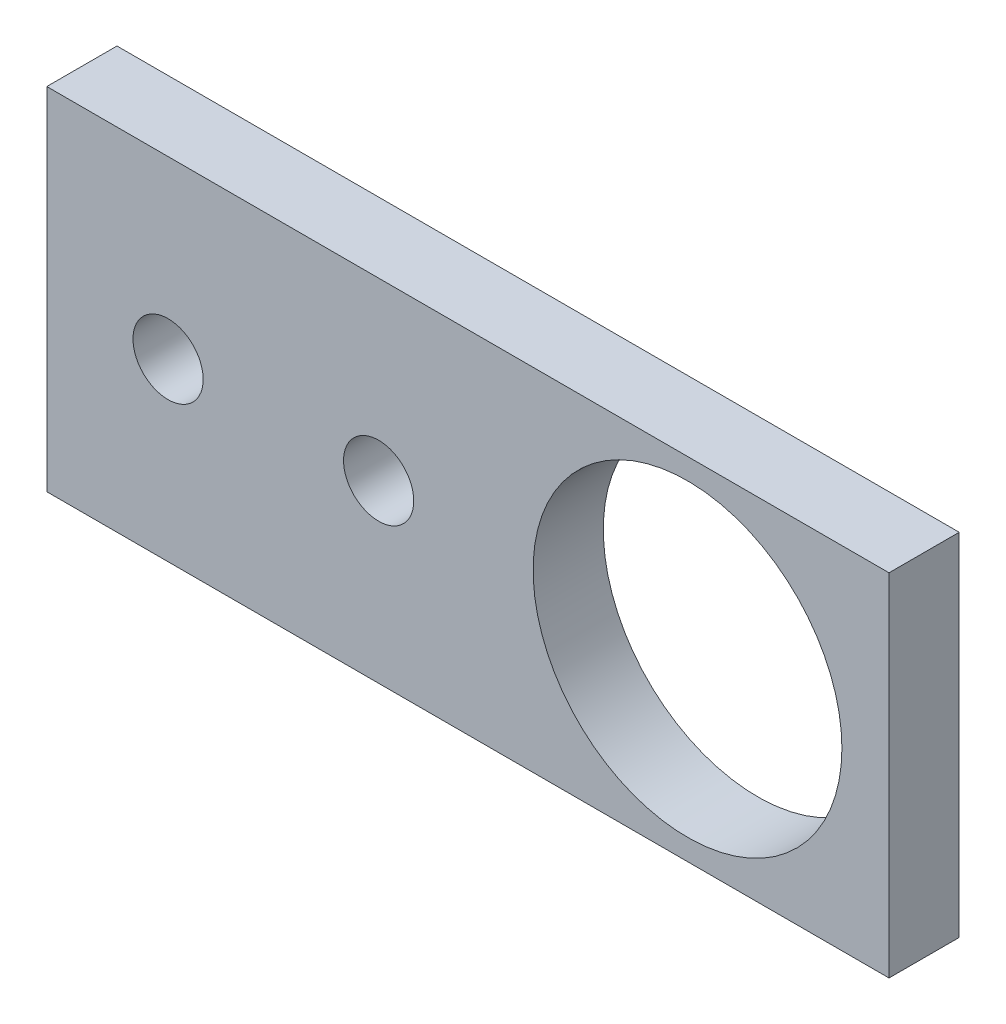
ISO-10303-21;
HEADER;
FILE_DESCRIPTION(('STEP AP214'),'2;1');
FILE_NAME('part.step','',(''),(''),'','','');
FILE_SCHEMA(('AUTOMOTIVE_DESIGN { 1 0 10303 214 1 1 1 1 }'));
ENDSEC;
DATA;
#1=APPLICATION_CONTEXT('core data for automotive mechanical design processes');
#2=APPLICATION_PROTOCOL_DEFINITION('international standard','automotive_design',2000,#1);
#3=PRODUCT_CONTEXT('',#1,'mechanical');
#4=PRODUCT('Part','Part','',(#3));
#5=PRODUCT_RELATED_PRODUCT_CATEGORY('part','',(#4));
#6=PRODUCT_DEFINITION_FORMATION('','',#4);
#7=PRODUCT_DEFINITION_CONTEXT('part definition',#1,'design');
#8=PRODUCT_DEFINITION('design','',#6,#7);
#9=PRODUCT_DEFINITION_SHAPE('','',#8);
#10=(LENGTH_UNIT() NAMED_UNIT(*) SI_UNIT(.MILLI.,.METRE.));
#11=(NAMED_UNIT(*) PLANE_ANGLE_UNIT() SI_UNIT($,.RADIAN.));
#12=(NAMED_UNIT(*) SI_UNIT($,.STERADIAN.) SOLID_ANGLE_UNIT());
#13=UNCERTAINTY_MEASURE_WITH_UNIT(LENGTH_MEASURE(1.E-05),#10,'distance_accuracy_value','');
#14=(GEOMETRIC_REPRESENTATION_CONTEXT(3) GLOBAL_UNCERTAINTY_ASSIGNED_CONTEXT((#13)) GLOBAL_UNIT_ASSIGNED_CONTEXT((#10,
#11,#12)) REPRESENTATION_CONTEXT('',''));
#15=CARTESIAN_POINT('',(0.,0.,0.));
#16=DIRECTION('',(0.,0.,1.));
#17=DIRECTION('',(1.,0.,0.));
#18=AXIS2_PLACEMENT_3D('',#15,#16,#17);
#19=CARTESIAN_POINT('',(0.,0.,5.));
#20=DIRECTION('',(0.,0.,-1.));
#21=DIRECTION('',(-1.,0.,0.));
#22=AXIS2_PLACEMENT_3D('',#19,#20,#21);
#23=PLANE('',#22);
#24=DIRECTION('',(0.,-1.,0.));
#25=VECTOR('',#24,1.);
#26=CARTESIAN_POINT('',(-30.,12.5,5.));
#27=LINE('',#26,#25);
#28=CARTESIAN_POINT('',(-30.,12.5,5.));
#29=VERTEX_POINT('',#28);
#30=CARTESIAN_POINT('',(-30.,-12.5,5.));
#31=VERTEX_POINT('',#30);
#32=EDGE_CURVE('E92',#29,#31,#27,.T.);
#33=ORIENTED_EDGE('',*,*,#32,.T.);
#34=DIRECTION('',(1.,0.,0.));
#35=VECTOR('',#34,1.);
#36=CARTESIAN_POINT('',(30.,-12.5,5.));
#37=LINE('',#36,#35);
#38=CARTESIAN_POINT('',(30.,-12.5,5.));
#39=VERTEX_POINT('',#38);
#40=EDGE_CURVE('E87',#31,#39,#37,.T.);
#41=ORIENTED_EDGE('',*,*,#40,.T.);
#42=DIRECTION('',(0.,1.,0.));
#43=VECTOR('',#42,1.);
#44=CARTESIAN_POINT('',(30.,12.5,5.));
#45=LINE('',#44,#43);
#46=CARTESIAN_POINT('',(30.,12.5,5.));
#47=VERTEX_POINT('',#46);
#48=EDGE_CURVE('E90',#39,#47,#45,.T.);
#49=ORIENTED_EDGE('',*,*,#48,.T.);
#50=DIRECTION('',(-1.,0.,0.));
#51=VECTOR('',#50,1.);
#52=CARTESIAN_POINT('',(30.,12.5,5.));
#53=LINE('',#52,#51);
#54=EDGE_CURVE('E57',#47,#29,#53,.T.);
#55=ORIENTED_EDGE('',*,*,#54,.T.);
#56=EDGE_LOOP('',(#33,#41,#49,#55));
#57=FACE_BOUND('',#56,.T.);
#58=CARTESIAN_POINT('',(-21.359853693078,0.,5.));
#59=DIRECTION('',(0.,0.,1.));
#60=DIRECTION('',(1.,0.,0.));
#61=AXIS2_PLACEMENT_3D('',#58,#59,#60);
#62=CIRCLE('',#61,2.5);
#63=CARTESIAN_POINT('',(-18.859853693078,0.,5.));
#64=VERTEX_POINT('',#63);
#65=EDGE_CURVE('E112',#64,#64,#62,.T.);
#66=ORIENTED_EDGE('',*,*,#65,.F.);
#67=EDGE_LOOP('',(#66));
#68=FACE_BOUND('',#67,.T.);
#69=CARTESIAN_POINT('',(15.644174595942,0.,5.));
#70=DIRECTION('',(0.,0.,1.));
#71=DIRECTION('',(1.,0.,0.));
#72=AXIS2_PLACEMENT_3D('',#69,#70,#71);
#73=CIRCLE('',#72,11.);
#74=CARTESIAN_POINT('',(26.644174595942,0.,5.));
#75=VERTEX_POINT('',#74);
#76=EDGE_CURVE('E134',#75,#75,#73,.T.);
#77=ORIENTED_EDGE('',*,*,#76,.F.);
#78=EDGE_LOOP('',(#77));
#79=FACE_BOUND('',#78,.T.);
#80=CARTESIAN_POINT('',(-6.35985369307797,0.,5.));
#81=DIRECTION('',(0.,0.,1.));
#82=DIRECTION('',(1.,0.,0.));
#83=AXIS2_PLACEMENT_3D('',#80,#81,#82);
#84=CIRCLE('',#83,2.5);
#85=CARTESIAN_POINT('',(-3.85985369307797,0.,5.));
#86=VERTEX_POINT('',#85);
#87=EDGE_CURVE('E142',#86,#86,#84,.T.);
#88=ORIENTED_EDGE('',*,*,#87,.F.);
#89=EDGE_LOOP('',(#88));
#90=FACE_BOUND('',#89,.T.);
#91=ADVANCED_FACE('F39',(#57,#68,#79,#90),#23,.F.);
#92=CARTESIAN_POINT('',(0.,0.,0.));
#93=DIRECTION('',(0.,0.,-1.));
#94=DIRECTION('',(-1.,0.,0.));
#95=AXIS2_PLACEMENT_3D('',#92,#93,#94);
#96=PLANE('',#95);
#97=CARTESIAN_POINT('',(15.644174595942,0.,0.));
#98=DIRECTION('',(0.,0.,1.));
#99=DIRECTION('',(1.,0.,0.));
#100=AXIS2_PLACEMENT_3D('',#97,#98,#99);
#101=CIRCLE('',#100,11.);
#102=CARTESIAN_POINT('',(26.644174595942,0.,0.));
#103=VERTEX_POINT('',#102);
#104=EDGE_CURVE('E138',#103,#103,#101,.T.);
#105=ORIENTED_EDGE('',*,*,#104,.T.);
#106=EDGE_LOOP('',(#105));
#107=FACE_BOUND('',#106,.T.);
#108=DIRECTION('',(0.,-1.,0.));
#109=VECTOR('',#108,1.);
#110=CARTESIAN_POINT('',(-30.,12.5,0.));
#111=LINE('',#110,#109);
#112=CARTESIAN_POINT('',(-30.,12.5,0.));
#113=VERTEX_POINT('',#112);
#114=CARTESIAN_POINT('',(-30.,-12.5,0.));
#115=VERTEX_POINT('',#114);
#116=EDGE_CURVE('E108',#113,#115,#111,.T.);
#117=ORIENTED_EDGE('',*,*,#116,.F.);
#118=DIRECTION('',(-1.,0.,0.));
#119=VECTOR('',#118,1.);
#120=CARTESIAN_POINT('',(30.,12.5,0.));
#121=LINE('',#120,#119);
#122=CARTESIAN_POINT('',(30.,12.5,0.));
#123=VERTEX_POINT('',#122);
#124=EDGE_CURVE('E80',#123,#113,#121,.T.);
#125=ORIENTED_EDGE('',*,*,#124,.F.);
#126=DIRECTION('',(0.,1.,0.));
#127=VECTOR('',#126,1.);
#128=CARTESIAN_POINT('',(30.,12.5,0.));
#129=LINE('',#128,#127);
#130=CARTESIAN_POINT('',(30.,-12.5,0.));
#131=VERTEX_POINT('',#130);
#132=EDGE_CURVE('E74',#131,#123,#129,.T.);
#133=ORIENTED_EDGE('',*,*,#132,.F.);
#134=DIRECTION('',(1.,0.,0.));
#135=VECTOR('',#134,1.);
#136=CARTESIAN_POINT('',(30.,-12.5,0.));
#137=LINE('',#136,#135);
#138=EDGE_CURVE('E97',#115,#131,#137,.T.);
#139=ORIENTED_EDGE('',*,*,#138,.F.);
#140=EDGE_LOOP('',(#117,#125,#133,#139));
#141=FACE_BOUND('',#140,.T.);
#142=CARTESIAN_POINT('',(-21.359853693078,0.,0.));
#143=DIRECTION('',(0.,0.,1.));
#144=DIRECTION('',(1.,0.,0.));
#145=AXIS2_PLACEMENT_3D('',#142,#143,#144);
#146=CIRCLE('',#145,2.5);
#147=CARTESIAN_POINT('',(-18.859853693078,0.,0.));
#148=VERTEX_POINT('',#147);
#149=EDGE_CURVE('E130',#148,#148,#146,.T.);
#150=ORIENTED_EDGE('',*,*,#149,.T.);
#151=EDGE_LOOP('',(#150));
#152=FACE_BOUND('',#151,.T.);
#153=CARTESIAN_POINT('',(-6.35985369307797,0.,0.));
#154=DIRECTION('',(0.,0.,1.));
#155=DIRECTION('',(1.,0.,0.));
#156=AXIS2_PLACEMENT_3D('',#153,#154,#155);
#157=CIRCLE('',#156,2.5);
#158=CARTESIAN_POINT('',(-3.85985369307797,0.,0.));
#159=VERTEX_POINT('',#158);
#160=EDGE_CURVE('E146',#159,#159,#157,.T.);
#161=ORIENTED_EDGE('',*,*,#160,.T.);
#162=EDGE_LOOP('',(#161));
#163=FACE_BOUND('',#162,.T.);
#164=ADVANCED_FACE('F125',(#107,#141,#152,#163),#96,.T.);
#165=CARTESIAN_POINT('',(-30.,12.5,5.));
#166=DIRECTION('',(1.,0.,0.));
#167=DIRECTION('',(0.,1.,0.));
#168=AXIS2_PLACEMENT_3D('',#165,#166,#167);
#169=PLANE('',#168);
#170=ORIENTED_EDGE('',*,*,#116,.T.);
#171=DIRECTION('',(0.,0.,-1.));
#172=VECTOR('',#171,1.);
#173=CARTESIAN_POINT('',(-30.,-12.5,5.));
#174=LINE('',#173,#172);
#175=EDGE_CURVE('E11',#31,#115,#174,.T.);
#176=ORIENTED_EDGE('',*,*,#175,.F.);
#177=ORIENTED_EDGE('',*,*,#32,.F.);
#178=DIRECTION('',(0.,0.,-1.));
#179=VECTOR('',#178,1.);
#180=CARTESIAN_POINT('',(-30.,12.5,5.));
#181=LINE('',#180,#179);
#182=EDGE_CURVE('E104',#29,#113,#181,.T.);
#183=ORIENTED_EDGE('',*,*,#182,.T.);
#184=EDGE_LOOP('',(#170,#176,#177,#183));
#185=FACE_BOUND('',#184,.T.);
#186=ADVANCED_FACE('F41',(#185),#169,.F.);
#187=CARTESIAN_POINT('',(30.,-12.5,5.));
#188=DIRECTION('',(0.,1.,0.));
#189=DIRECTION('',(-1.,0.,0.));
#190=AXIS2_PLACEMENT_3D('',#187,#188,#189);
#191=PLANE('',#190);
#192=ORIENTED_EDGE('',*,*,#138,.T.);
#193=DIRECTION('',(0.,0.,-1.));
#194=VECTOR('',#193,1.);
#195=CARTESIAN_POINT('',(30.,-12.5,5.));
#196=LINE('',#195,#194);
#197=EDGE_CURVE('E49',#39,#131,#196,.T.);
#198=ORIENTED_EDGE('',*,*,#197,.F.);
#199=ORIENTED_EDGE('',*,*,#40,.F.);
#200=ORIENTED_EDGE('',*,*,#175,.T.);
#201=EDGE_LOOP('',(#192,#198,#199,#200));
#202=FACE_BOUND('',#201,.T.);
#203=ADVANCED_FACE('F96',(#202),#191,.F.);
#204=CARTESIAN_POINT('',(30.,12.5,5.));
#205=DIRECTION('',(-1.,0.,0.));
#206=DIRECTION('',(0.,-1.,0.));
#207=AXIS2_PLACEMENT_3D('',#204,#205,#206);
#208=PLANE('',#207);
#209=ORIENTED_EDGE('',*,*,#132,.T.);
#210=DIRECTION('',(0.,0.,-1.));
#211=VECTOR('',#210,1.);
#212=CARTESIAN_POINT('',(30.,12.5,5.));
#213=LINE('',#212,#211);
#214=EDGE_CURVE('E99',#47,#123,#213,.T.);
#215=ORIENTED_EDGE('',*,*,#214,.F.);
#216=ORIENTED_EDGE('',*,*,#48,.F.);
#217=ORIENTED_EDGE('',*,*,#197,.T.);
#218=EDGE_LOOP('',(#209,#215,#216,#217));
#219=FACE_BOUND('',#218,.T.);
#220=ADVANCED_FACE('F100',(#219),#208,.F.);
#221=CARTESIAN_POINT('',(30.,12.5,5.));
#222=DIRECTION('',(0.,-1.,0.));
#223=DIRECTION('',(1.,0.,0.));
#224=AXIS2_PLACEMENT_3D('',#221,#222,#223);
#225=PLANE('',#224);
#226=ORIENTED_EDGE('',*,*,#124,.T.);
#227=ORIENTED_EDGE('',*,*,#182,.F.);
#228=ORIENTED_EDGE('',*,*,#54,.F.);
#229=ORIENTED_EDGE('',*,*,#214,.T.);
#230=EDGE_LOOP('',(#226,#227,#228,#229));
#231=FACE_BOUND('',#230,.T.);
#232=ADVANCED_FACE('F122',(#231),#225,.F.);
#233=CARTESIAN_POINT('',(-21.359853693078,0.,5.));
#234=DIRECTION('',(0.,0.,-1.));
#235=DIRECTION('',(-1.,0.,0.));
#236=AXIS2_PLACEMENT_3D('',#233,#234,#235);
#237=CYLINDRICAL_SURFACE('',#236,2.5);
#238=ORIENTED_EDGE('',*,*,#65,.T.);
#239=EDGE_LOOP('',(#238));
#240=FACE_BOUND('',#239,.T.);
#241=ORIENTED_EDGE('',*,*,#149,.F.);
#242=EDGE_LOOP('',(#241));
#243=FACE_BOUND('',#242,.T.);
#244=ADVANCED_FACE('F165',(#240,#243),#237,.F.);
#245=CARTESIAN_POINT('',(15.644174595942,0.,5.));
#246=DIRECTION('',(0.,0.,-1.));
#247=DIRECTION('',(-1.,0.,0.));
#248=AXIS2_PLACEMENT_3D('',#245,#246,#247);
#249=CYLINDRICAL_SURFACE('',#248,11.);
#250=ORIENTED_EDGE('',*,*,#76,.T.);
#251=EDGE_LOOP('',(#250));
#252=FACE_BOUND('',#251,.T.);
#253=ORIENTED_EDGE('',*,*,#104,.F.);
#254=EDGE_LOOP('',(#253));
#255=FACE_BOUND('',#254,.T.);
#256=ADVANCED_FACE('F211',(#252,#255),#249,.F.);
#257=CARTESIAN_POINT('',(-6.35985369307797,0.,5.));
#258=DIRECTION('',(0.,0.,-1.));
#259=DIRECTION('',(-1.,0.,0.));
#260=AXIS2_PLACEMENT_3D('',#257,#258,#259);
#261=CYLINDRICAL_SURFACE('',#260,2.5);
#262=ORIENTED_EDGE('',*,*,#87,.T.);
#263=EDGE_LOOP('',(#262));
#264=FACE_BOUND('',#263,.T.);
#265=ORIENTED_EDGE('',*,*,#160,.F.);
#266=EDGE_LOOP('',(#265));
#267=FACE_BOUND('',#266,.T.);
#268=ADVANCED_FACE('F154',(#264,#267),#261,.F.);
#269=CLOSED_SHELL('',(#91,#164,#186,#203,#220,#232,#244,#256,#268));
#270=MANIFOLD_SOLID_BREP('B2',#269);
#271=ADVANCED_BREP_SHAPE_REPRESENTATION('',(#18,#270),#14);
#272=SHAPE_DEFINITION_REPRESENTATION(#9,#271);
ENDSEC;
END-ISO-10303-21;
